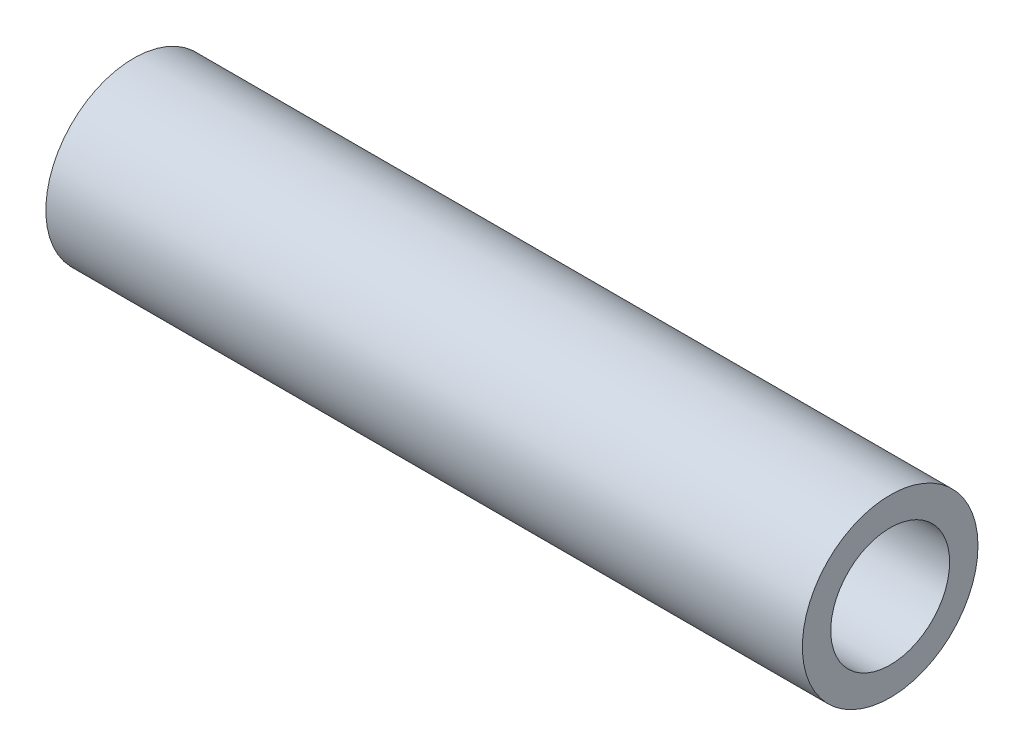
ISO-10303-21;
HEADER;
FILE_DESCRIPTION(('STEP AP214'),'2;1');
FILE_NAME('part.step','',(''),(''),'','','');
FILE_SCHEMA(('AUTOMOTIVE_DESIGN { 1 0 10303 214 1 1 1 1 }'));
ENDSEC;
DATA;
#1=APPLICATION_CONTEXT('core data for automotive mechanical design processes');
#2=APPLICATION_PROTOCOL_DEFINITION('international standard','automotive_design',2000,#1);
#3=PRODUCT_CONTEXT('',#1,'mechanical');
#4=PRODUCT('Part','Part','',(#3));
#5=PRODUCT_RELATED_PRODUCT_CATEGORY('part','',(#4));
#6=PRODUCT_DEFINITION_FORMATION('','',#4);
#7=PRODUCT_DEFINITION_CONTEXT('part definition',#1,'design');
#8=PRODUCT_DEFINITION('design','',#6,#7);
#9=PRODUCT_DEFINITION_SHAPE('','',#8);
#10=(LENGTH_UNIT() NAMED_UNIT(*) SI_UNIT(.MILLI.,.METRE.));
#11=(NAMED_UNIT(*) PLANE_ANGLE_UNIT() SI_UNIT($,.RADIAN.));
#12=(NAMED_UNIT(*) SI_UNIT($,.STERADIAN.) SOLID_ANGLE_UNIT());
#13=UNCERTAINTY_MEASURE_WITH_UNIT(LENGTH_MEASURE(1.E-05),#10,'distance_accuracy_value','');
#14=(GEOMETRIC_REPRESENTATION_CONTEXT(3) GLOBAL_UNCERTAINTY_ASSIGNED_CONTEXT((#13)) GLOBAL_UNIT_ASSIGNED_CONTEXT((#10,
#11,#12)) REPRESENTATION_CONTEXT('',''));
#15=CARTESIAN_POINT('',(0.,0.,0.));
#16=DIRECTION('',(0.,0.,1.));
#17=DIRECTION('',(1.,0.,0.));
#18=AXIS2_PLACEMENT_3D('',#15,#16,#17);
#19=CARTESIAN_POINT('',(28.,0.,0.));
#20=DIRECTION('',(1.,0.,0.));
#21=DIRECTION('',(0.,0.,-1.));
#22=AXIS2_PLACEMENT_3D('',#19,#20,#21);
#23=PLANE('',#22);
#24=CARTESIAN_POINT('',(28.,0.,0.));
#25=DIRECTION('',(1.,0.,0.));
#26=DIRECTION('',(0.,0.,-1.));
#27=AXIS2_PLACEMENT_3D('',#24,#25,#26);
#28=CIRCLE('',#27,3.25);
#29=CARTESIAN_POINT('',(28.,0.,-3.25));
#30=VERTEX_POINT('',#29);
#31=EDGE_CURVE('E10',#30,#30,#28,.T.);
#32=ORIENTED_EDGE('',*,*,#31,.T.);
#33=EDGE_LOOP('',(#32));
#34=FACE_BOUND('',#33,.T.);
#35=CARTESIAN_POINT('',(28.,0.,0.));
#36=DIRECTION('',(1.,0.,0.));
#37=DIRECTION('',(0.,0.,-1.));
#38=AXIS2_PLACEMENT_3D('',#35,#36,#37);
#39=CIRCLE('',#38,2.2);
#40=CARTESIAN_POINT('',(28.,0.,-2.2));
#41=VERTEX_POINT('',#40);
#42=EDGE_CURVE('E50',#41,#41,#39,.T.);
#43=ORIENTED_EDGE('',*,*,#42,.F.);
#44=EDGE_LOOP('',(#43));
#45=FACE_BOUND('',#44,.T.);
#46=ADVANCED_FACE('F36',(#34,#45),#23,.T.);
#47=CARTESIAN_POINT('',(0.,0.,0.));
#48=DIRECTION('',(1.,0.,0.));
#49=DIRECTION('',(0.,0.,-1.));
#50=AXIS2_PLACEMENT_3D('',#47,#48,#49);
#51=PLANE('',#50);
#52=CARTESIAN_POINT('',(0.,0.,0.));
#53=DIRECTION('',(1.,0.,0.));
#54=DIRECTION('',(0.,0.,-1.));
#55=AXIS2_PLACEMENT_3D('',#52,#53,#54);
#56=CIRCLE('',#55,3.25);
#57=CARTESIAN_POINT('',(0.,0.,-3.25));
#58=VERTEX_POINT('',#57);
#59=EDGE_CURVE('E40',#58,#58,#56,.T.);
#60=ORIENTED_EDGE('',*,*,#59,.F.);
#61=EDGE_LOOP('',(#60));
#62=FACE_BOUND('',#61,.T.);
#63=CARTESIAN_POINT('',(0.,0.,0.));
#64=DIRECTION('',(1.,0.,0.));
#65=DIRECTION('',(0.,0.,-1.));
#66=AXIS2_PLACEMENT_3D('',#63,#64,#65);
#67=CIRCLE('',#66,2.2);
#68=CARTESIAN_POINT('',(0.,0.,-2.2));
#69=VERTEX_POINT('',#68);
#70=EDGE_CURVE('E52',#69,#69,#67,.T.);
#71=ORIENTED_EDGE('',*,*,#70,.T.);
#72=EDGE_LOOP('',(#71));
#73=FACE_BOUND('',#72,.T.);
#74=ADVANCED_FACE('F63',(#62,#73),#51,.F.);
#75=CARTESIAN_POINT('',(28.,0.,0.));
#76=DIRECTION('',(-1.,0.,0.));
#77=DIRECTION('',(0.,0.,1.));
#78=AXIS2_PLACEMENT_3D('',#75,#76,#77);
#79=CYLINDRICAL_SURFACE('',#78,3.25);
#80=ORIENTED_EDGE('',*,*,#31,.F.);
#81=EDGE_LOOP('',(#80));
#82=FACE_BOUND('',#81,.T.);
#83=ORIENTED_EDGE('',*,*,#59,.T.);
#84=EDGE_LOOP('',(#83));
#85=FACE_BOUND('',#84,.T.);
#86=ADVANCED_FACE('F38',(#82,#85),#79,.T.);
#87=CARTESIAN_POINT('',(28.,0.,0.));
#88=DIRECTION('',(-1.,0.,0.));
#89=DIRECTION('',(0.,0.,1.));
#90=AXIS2_PLACEMENT_3D('',#87,#88,#89);
#91=CYLINDRICAL_SURFACE('',#90,2.2);
#92=ORIENTED_EDGE('',*,*,#42,.T.);
#93=EDGE_LOOP('',(#92));
#94=FACE_BOUND('',#93,.T.);
#95=ORIENTED_EDGE('',*,*,#70,.F.);
#96=EDGE_LOOP('',(#95));
#97=FACE_BOUND('',#96,.T.);
#98=ADVANCED_FACE('F59',(#94,#97),#91,.F.);
#99=CLOSED_SHELL('',(#46,#74,#86,#98));
#100=MANIFOLD_SOLID_BREP('B2',#99);
#101=ADVANCED_BREP_SHAPE_REPRESENTATION('',(#18,#100),#14);
#102=SHAPE_DEFINITION_REPRESENTATION(#9,#101);
ENDSEC;
END-ISO-10303-21;
